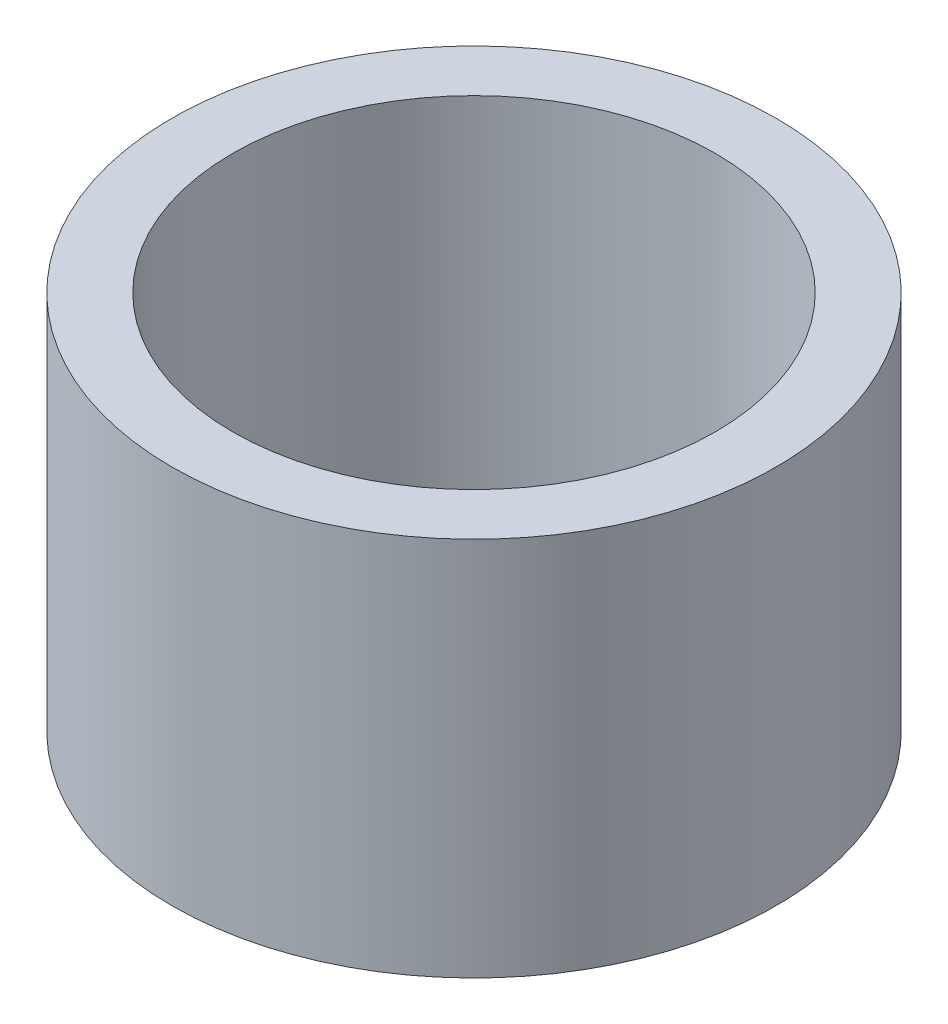
ISO-10303-21;
HEADER;
FILE_DESCRIPTION(('STEP AP214'),'2;1');
FILE_NAME('part.step','',(''),(''),'','','');
FILE_SCHEMA(('AUTOMOTIVE_DESIGN { 1 0 10303 214 1 1 1 1 }'));
ENDSEC;
DATA;
#1=APPLICATION_CONTEXT('core data for automotive mechanical design processes');
#2=APPLICATION_PROTOCOL_DEFINITION('international standard','automotive_design',2000,#1);
#3=PRODUCT_CONTEXT('',#1,'mechanical');
#4=PRODUCT('Part','Part','',(#3));
#5=PRODUCT_RELATED_PRODUCT_CATEGORY('part','',(#4));
#6=PRODUCT_DEFINITION_FORMATION('','',#4);
#7=PRODUCT_DEFINITION_CONTEXT('part definition',#1,'design');
#8=PRODUCT_DEFINITION('design','',#6,#7);
#9=PRODUCT_DEFINITION_SHAPE('','',#8);
#10=(LENGTH_UNIT() NAMED_UNIT(*) SI_UNIT(.MILLI.,.METRE.));
#11=(NAMED_UNIT(*) PLANE_ANGLE_UNIT() SI_UNIT($,.RADIAN.));
#12=(NAMED_UNIT(*) SI_UNIT($,.STERADIAN.) SOLID_ANGLE_UNIT());
#13=UNCERTAINTY_MEASURE_WITH_UNIT(LENGTH_MEASURE(1.E-05),#10,'distance_accuracy_value','');
#14=(GEOMETRIC_REPRESENTATION_CONTEXT(3) GLOBAL_UNCERTAINTY_ASSIGNED_CONTEXT((#13)) GLOBAL_UNIT_ASSIGNED_CONTEXT((#10,
#11,#12)) REPRESENTATION_CONTEXT('',''));
#15=CARTESIAN_POINT('',(0.,0.,0.));
#16=DIRECTION('',(0.,0.,1.));
#17=DIRECTION('',(1.,0.,0.));
#18=AXIS2_PLACEMENT_3D('',#15,#16,#17);
#19=CARTESIAN_POINT('',(0.,50.,0.));
#20=DIRECTION('',(0.,1.,0.));
#21=DIRECTION('',(0.,0.,1.));
#22=AXIS2_PLACEMENT_3D('',#19,#20,#21);
#23=PLANE('',#22);
#24=CARTESIAN_POINT('',(0.,50.,0.));
#25=DIRECTION('',(0.,1.,0.));
#26=DIRECTION('',(0.,0.,1.));
#27=AXIS2_PLACEMENT_3D('',#24,#25,#26);
#28=CIRCLE('',#27,39.75);
#29=CARTESIAN_POINT('',(0.,50.,39.75));
#30=VERTEX_POINT('',#29);
#31=EDGE_CURVE('E10',#30,#30,#28,.T.);
#32=ORIENTED_EDGE('',*,*,#31,.T.);
#33=EDGE_LOOP('',(#32));
#34=FACE_BOUND('',#33,.T.);
#35=CARTESIAN_POINT('',(0.,50.,0.));
#36=DIRECTION('',(0.,1.,0.));
#37=DIRECTION('',(0.,0.,1.));
#38=AXIS2_PLACEMENT_3D('',#35,#36,#37);
#39=CIRCLE('',#38,31.75);
#40=CARTESIAN_POINT('',(0.,50.,31.75));
#41=VERTEX_POINT('',#40);
#42=EDGE_CURVE('E50',#41,#41,#39,.T.);
#43=ORIENTED_EDGE('',*,*,#42,.F.);
#44=EDGE_LOOP('',(#43));
#45=FACE_BOUND('',#44,.T.);
#46=ADVANCED_FACE('F37',(#34,#45),#23,.T.);
#47=CARTESIAN_POINT('',(0.,0.,0.));
#48=DIRECTION('',(0.,1.,0.));
#49=DIRECTION('',(0.,0.,1.));
#50=AXIS2_PLACEMENT_3D('',#47,#48,#49);
#51=PLANE('',#50);
#52=CARTESIAN_POINT('',(0.,0.,0.));
#53=DIRECTION('',(0.,1.,0.));
#54=DIRECTION('',(0.,0.,1.));
#55=AXIS2_PLACEMENT_3D('',#52,#53,#54);
#56=CIRCLE('',#55,39.75);
#57=CARTESIAN_POINT('',(0.,0.,39.75));
#58=VERTEX_POINT('',#57);
#59=EDGE_CURVE('E41',#58,#58,#56,.T.);
#60=ORIENTED_EDGE('',*,*,#59,.F.);
#61=EDGE_LOOP('',(#60));
#62=FACE_BOUND('',#61,.T.);
#63=CARTESIAN_POINT('',(0.,0.,0.));
#64=DIRECTION('',(0.,1.,0.));
#65=DIRECTION('',(0.,0.,1.));
#66=AXIS2_PLACEMENT_3D('',#63,#64,#65);
#67=CIRCLE('',#66,31.75);
#68=CARTESIAN_POINT('',(0.,0.,31.75));
#69=VERTEX_POINT('',#68);
#70=EDGE_CURVE('E52',#69,#69,#67,.T.);
#71=ORIENTED_EDGE('',*,*,#70,.T.);
#72=EDGE_LOOP('',(#71));
#73=FACE_BOUND('',#72,.T.);
#74=ADVANCED_FACE('F64',(#62,#73),#51,.F.);
#75=CARTESIAN_POINT('',(0.,50.,0.));
#76=DIRECTION('',(0.,-1.,0.));
#77=DIRECTION('',(0.,0.,-1.));
#78=AXIS2_PLACEMENT_3D('',#75,#76,#77);
#79=CYLINDRICAL_SURFACE('',#78,39.75);
#80=ORIENTED_EDGE('',*,*,#31,.F.);
#81=EDGE_LOOP('',(#80));
#82=FACE_BOUND('',#81,.T.);
#83=ORIENTED_EDGE('',*,*,#59,.T.);
#84=EDGE_LOOP('',(#83));
#85=FACE_BOUND('',#84,.T.);
#86=ADVANCED_FACE('F39',(#82,#85),#79,.T.);
#87=CARTESIAN_POINT('',(0.,50.,0.));
#88=DIRECTION('',(0.,-1.,0.));
#89=DIRECTION('',(0.,0.,-1.));
#90=AXIS2_PLACEMENT_3D('',#87,#88,#89);
#91=CYLINDRICAL_SURFACE('',#90,31.75);
#92=ORIENTED_EDGE('',*,*,#42,.T.);
#93=EDGE_LOOP('',(#92));
#94=FACE_BOUND('',#93,.T.);
#95=ORIENTED_EDGE('',*,*,#70,.F.);
#96=EDGE_LOOP('',(#95));
#97=FACE_BOUND('',#96,.T.);
#98=ADVANCED_FACE('F60',(#94,#97),#91,.F.);
#99=CLOSED_SHELL('',(#46,#74,#86,#98));
#100=MANIFOLD_SOLID_BREP('B2',#99);
#101=ADVANCED_BREP_SHAPE_REPRESENTATION('',(#18,#100),#14);
#102=SHAPE_DEFINITION_REPRESENTATION(#9,#101);
ENDSEC;
END-ISO-10303-21;
